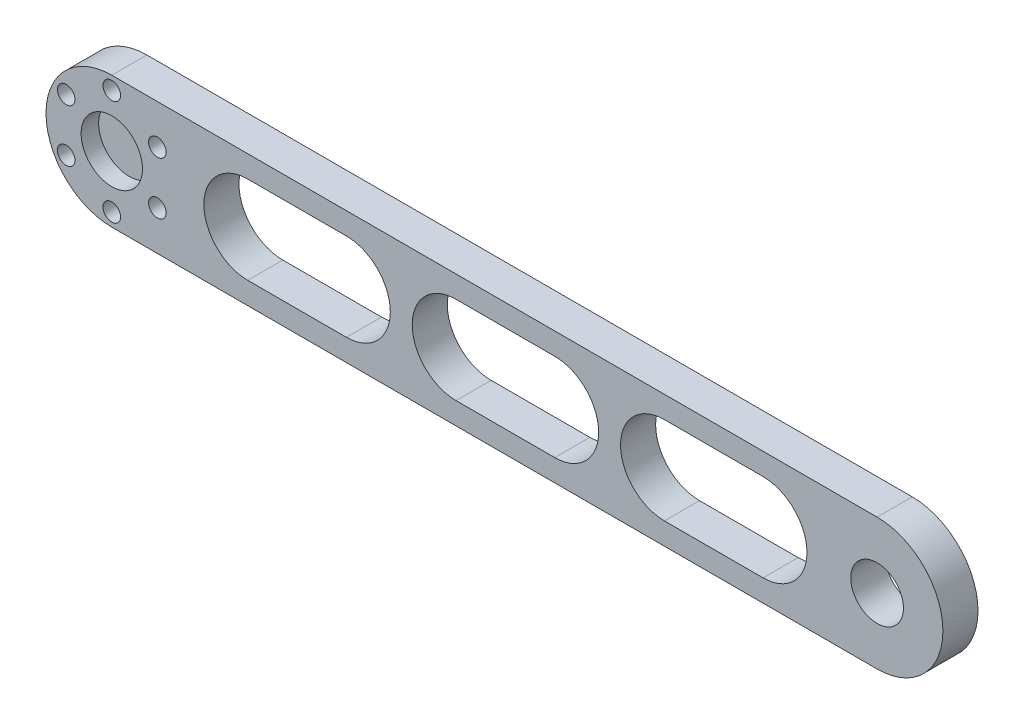
ISO-10303-21;
HEADER;
FILE_DESCRIPTION(('STEP AP214'),'2;1');
FILE_NAME('part.step','',(''),(''),'','','');
FILE_SCHEMA(('AUTOMOTIVE_DESIGN { 1 0 10303 214 1 1 1 1 }'));
ENDSEC;
DATA;
#1=APPLICATION_CONTEXT('core data for automotive mechanical design processes');
#2=APPLICATION_PROTOCOL_DEFINITION('international standard','automotive_design',2000,#1);
#3=PRODUCT_CONTEXT('',#1,'mechanical');
#4=PRODUCT('Part','Part','',(#3));
#5=PRODUCT_RELATED_PRODUCT_CATEGORY('part','',(#4));
#6=PRODUCT_DEFINITION_FORMATION('','',#4);
#7=PRODUCT_DEFINITION_CONTEXT('part definition',#1,'design');
#8=PRODUCT_DEFINITION('design','',#6,#7);
#9=PRODUCT_DEFINITION_SHAPE('','',#8);
#10=(LENGTH_UNIT() NAMED_UNIT(*) SI_UNIT(.MILLI.,.METRE.));
#11=(NAMED_UNIT(*) PLANE_ANGLE_UNIT() SI_UNIT($,.RADIAN.));
#12=(NAMED_UNIT(*) SI_UNIT($,.STERADIAN.) SOLID_ANGLE_UNIT());
#13=UNCERTAINTY_MEASURE_WITH_UNIT(LENGTH_MEASURE(1.E-05),#10,'distance_accuracy_value','');
#14=(GEOMETRIC_REPRESENTATION_CONTEXT(3) GLOBAL_UNCERTAINTY_ASSIGNED_CONTEXT((#13)) GLOBAL_UNIT_ASSIGNED_CONTEXT((#10,
#11,#12)) REPRESENTATION_CONTEXT('',''));
#15=CARTESIAN_POINT('',(0.,0.,0.));
#16=DIRECTION('',(0.,0.,1.));
#17=DIRECTION('',(1.,0.,0.));
#18=AXIS2_PLACEMENT_3D('',#15,#16,#17);
#19=CARTESIAN_POINT('',(-87.25,0.,0.));
#20=DIRECTION('',(0.,0.,1.));
#21=DIRECTION('',(1.,0.,0.));
#22=AXIS2_PLACEMENT_3D('',#19,#20,#21);
#23=PLANE('',#22);
#24=CARTESIAN_POINT('',(-97.6423048454133,-5.99999999999991,0.));
#25=DIRECTION('',(0.,0.,-1.));
#26=DIRECTION('',(-1.,0.,0.));
#27=AXIS2_PLACEMENT_3D('',#24,#25,#26);
#28=CIRCLE('',#27,1.99999999999999);
#29=CARTESIAN_POINT('',(-99.6423048454133,-5.99999999999991,0.));
#30=VERTEX_POINT('',#29);
#31=EDGE_CURVE('E420',#30,#30,#28,.T.);
#32=ORIENTED_EDGE('',*,*,#31,.F.);
#33=EDGE_LOOP('',(#32));
#34=FACE_BOUND('',#33,.T.);
#35=CARTESIAN_POINT('',(-87.25,-12.,0.));
#36=DIRECTION('',(0.,0.,-1.));
#37=DIRECTION('',(-1.,0.,0.));
#38=AXIS2_PLACEMENT_3D('',#35,#36,#37);
#39=CIRCLE('',#38,1.99999999999999);
#40=CARTESIAN_POINT('',(-89.25,-12.,0.));
#41=VERTEX_POINT('',#40);
#42=EDGE_CURVE('E426',#41,#41,#39,.T.);
#43=ORIENTED_EDGE('',*,*,#42,.F.);
#44=EDGE_LOOP('',(#43));
#45=FACE_BOUND('',#44,.T.);
#46=CARTESIAN_POINT('',(-87.25,12.,0.));
#47=DIRECTION('',(0.,0.,-1.));
#48=DIRECTION('',(-1.,0.,0.));
#49=AXIS2_PLACEMENT_3D('',#46,#47,#48);
#50=CIRCLE('',#49,1.99999999999999);
#51=CARTESIAN_POINT('',(-89.25,12.,0.));
#52=VERTEX_POINT('',#51);
#53=EDGE_CURVE('E444',#52,#52,#50,.T.);
#54=ORIENTED_EDGE('',*,*,#53,.F.);
#55=EDGE_LOOP('',(#54));
#56=FACE_BOUND('',#55,.T.);
#57=CARTESIAN_POINT('',(13.75,0.,0.));
#58=DIRECTION('',(0.,0.,1.));
#59=DIRECTION('',(1.,0.,0.));
#60=AXIS2_PLACEMENT_3D('',#57,#58,#59);
#61=CIRCLE('',#60,10.);
#62=CARTESIAN_POINT('',(13.75,-10.,0.));
#63=VERTEX_POINT('',#62);
#64=CARTESIAN_POINT('',(13.75,10.,0.));
#65=VERTEX_POINT('',#64);
#66=EDGE_CURVE('E169',#63,#65,#61,.T.);
#67=ORIENTED_EDGE('',*,*,#66,.T.);
#68=DIRECTION('',(-1.,0.,0.));
#69=VECTOR('',#68,1.);
#70=CARTESIAN_POINT('',(13.75,10.,0.));
#71=LINE('',#70,#69);
#72=CARTESIAN_POINT('',(-8.75,10.,0.));
#73=VERTEX_POINT('',#72);
#74=EDGE_CURVE('E205',#65,#73,#71,.T.);
#75=ORIENTED_EDGE('',*,*,#74,.T.);
#76=CARTESIAN_POINT('',(-8.75,0.,0.));
#77=DIRECTION('',(0.,0.,1.));
#78=DIRECTION('',(1.,0.,0.));
#79=AXIS2_PLACEMENT_3D('',#76,#77,#78);
#80=CIRCLE('',#79,10.);
#81=CARTESIAN_POINT('',(-8.75,-10.,0.));
#82=VERTEX_POINT('',#81);
#83=EDGE_CURVE('E208',#73,#82,#80,.T.);
#84=ORIENTED_EDGE('',*,*,#83,.T.);
#85=DIRECTION('',(1.,0.,0.));
#86=VECTOR('',#85,1.);
#87=CARTESIAN_POINT('',(13.75,-10.,0.));
#88=LINE('',#87,#86);
#89=EDGE_CURVE('E195',#82,#63,#88,.T.);
#90=ORIENTED_EDGE('',*,*,#89,.T.);
#91=EDGE_LOOP('',(#67,#75,#84,#90));
#92=FACE_BOUND('',#91,.T.);
#93=CARTESIAN_POINT('',(87.25,0.,0.));
#94=DIRECTION('',(0.,0.,1.));
#95=DIRECTION('',(1.,0.,0.));
#96=AXIS2_PLACEMENT_3D('',#93,#94,#95);
#97=CIRCLE('',#96,6.);
#98=CARTESIAN_POINT('',(93.25,0.,0.));
#99=VERTEX_POINT('',#98);
#100=EDGE_CURVE('E253',#99,#99,#97,.T.);
#101=ORIENTED_EDGE('',*,*,#100,.T.);
#102=EDGE_LOOP('',(#101));
#103=FACE_BOUND('',#102,.T.);
#104=CARTESIAN_POINT('',(-87.25,0.,0.));
#105=DIRECTION('',(0.,0.,1.));
#106=DIRECTION('',(1.,0.,0.));
#107=AXIS2_PLACEMENT_3D('',#104,#105,#106);
#108=CIRCLE('',#107,15.);
#109=CARTESIAN_POINT('',(-87.25,15.,0.));
#110=VERTEX_POINT('',#109);
#111=CARTESIAN_POINT('',(-87.25,-15.,0.));
#112=VERTEX_POINT('',#111);
#113=EDGE_CURVE('E257',#110,#112,#108,.T.);
#114=ORIENTED_EDGE('',*,*,#113,.F.);
#115=DIRECTION('',(-1.,0.,0.));
#116=VECTOR('',#115,1.);
#117=CARTESIAN_POINT('',(-87.25,15.,0.));
#118=LINE('',#117,#116);
#119=CARTESIAN_POINT('',(87.25,15.,0.));
#120=VERTEX_POINT('',#119);
#121=EDGE_CURVE('E264',#120,#110,#118,.T.);
#122=ORIENTED_EDGE('',*,*,#121,.F.);
#123=CARTESIAN_POINT('',(87.25,0.,0.));
#124=DIRECTION('',(0.,0.,1.));
#125=DIRECTION('',(1.,0.,0.));
#126=AXIS2_PLACEMENT_3D('',#123,#124,#125);
#127=CIRCLE('',#126,15.);
#128=CARTESIAN_POINT('',(87.25,-15.,0.));
#129=VERTEX_POINT('',#128);
#130=EDGE_CURVE('E275',#129,#120,#127,.T.);
#131=ORIENTED_EDGE('',*,*,#130,.F.);
#132=DIRECTION('',(1.,0.,0.));
#133=VECTOR('',#132,1.);
#134=CARTESIAN_POINT('',(-87.25,-15.,0.));
#135=LINE('',#134,#133);
#136=EDGE_CURVE('E273',#112,#129,#135,.T.);
#137=ORIENTED_EDGE('',*,*,#136,.F.);
#138=EDGE_LOOP('',(#114,#122,#131,#137));
#139=FACE_BOUND('',#138,.T.);
#140=CARTESIAN_POINT('',(61.25,0.,0.));
#141=DIRECTION('',(0.,0.,1.));
#142=DIRECTION('',(1.,0.,0.));
#143=AXIS2_PLACEMENT_3D('',#140,#141,#142);
#144=CIRCLE('',#143,10.);
#145=CARTESIAN_POINT('',(61.25,-10.,0.));
#146=VERTEX_POINT('',#145);
#147=CARTESIAN_POINT('',(61.25,10.,0.));
#148=VERTEX_POINT('',#147);
#149=EDGE_CURVE('E222',#146,#148,#144,.T.);
#150=ORIENTED_EDGE('',*,*,#149,.T.);
#151=DIRECTION('',(-1.,0.,0.));
#152=VECTOR('',#151,1.);
#153=CARTESIAN_POINT('',(61.25,10.,0.));
#154=LINE('',#153,#152);
#155=CARTESIAN_POINT('',(38.75,10.,0.));
#156=VERTEX_POINT('',#155);
#157=EDGE_CURVE('E236',#148,#156,#154,.T.);
#158=ORIENTED_EDGE('',*,*,#157,.T.);
#159=CARTESIAN_POINT('',(38.75,0.,0.));
#160=DIRECTION('',(0.,0.,1.));
#161=DIRECTION('',(1.,0.,0.));
#162=AXIS2_PLACEMENT_3D('',#159,#160,#161);
#163=CIRCLE('',#162,10.);
#164=CARTESIAN_POINT('',(38.75,-10.,0.));
#165=VERTEX_POINT('',#164);
#166=EDGE_CURVE('E239',#156,#165,#163,.T.);
#167=ORIENTED_EDGE('',*,*,#166,.T.);
#168=DIRECTION('',(1.,0.,0.));
#169=VECTOR('',#168,1.);
#170=CARTESIAN_POINT('',(61.25,-10.,0.));
#171=LINE('',#170,#169);
#172=EDGE_CURVE('E226',#165,#146,#171,.T.);
#173=ORIENTED_EDGE('',*,*,#172,.T.);
#174=EDGE_LOOP('',(#150,#158,#167,#173));
#175=FACE_BOUND('',#174,.T.);
#176=CARTESIAN_POINT('',(-33.75,0.,0.));
#177=DIRECTION('',(0.,0.,1.));
#178=DIRECTION('',(1.,0.,0.));
#179=AXIS2_PLACEMENT_3D('',#176,#177,#178);
#180=CIRCLE('',#179,10.);
#181=CARTESIAN_POINT('',(-33.75,-10.,0.));
#182=VERTEX_POINT('',#181);
#183=CARTESIAN_POINT('',(-33.75,10.,0.));
#184=VERTEX_POINT('',#183);
#185=EDGE_CURVE('E63',#182,#184,#180,.T.);
#186=ORIENTED_EDGE('',*,*,#185,.T.);
#187=DIRECTION('',(-1.,0.,0.));
#188=VECTOR('',#187,1.);
#189=CARTESIAN_POINT('',(-33.75,10.,0.));
#190=LINE('',#189,#188);
#191=CARTESIAN_POINT('',(-56.25,9.99999999999999,0.));
#192=VERTEX_POINT('',#191);
#193=EDGE_CURVE('E168',#184,#192,#190,.T.);
#194=ORIENTED_EDGE('',*,*,#193,.T.);
#195=CARTESIAN_POINT('',(-56.25,0.,0.));
#196=DIRECTION('',(0.,0.,1.));
#197=DIRECTION('',(1.,0.,0.));
#198=AXIS2_PLACEMENT_3D('',#195,#196,#197);
#199=CIRCLE('',#198,10.);
#200=CARTESIAN_POINT('',(-56.25,-10.,0.));
#201=VERTEX_POINT('',#200);
#202=EDGE_CURVE('E184',#192,#201,#199,.T.);
#203=ORIENTED_EDGE('',*,*,#202,.T.);
#204=DIRECTION('',(1.,0.,0.));
#205=VECTOR('',#204,1.);
#206=CARTESIAN_POINT('',(-33.75,-10.,0.));
#207=LINE('',#206,#205);
#208=EDGE_CURVE('E162',#201,#182,#207,.T.);
#209=ORIENTED_EDGE('',*,*,#208,.T.);
#210=EDGE_LOOP('',(#186,#194,#203,#209));
#211=FACE_BOUND('',#210,.T.);
#212=CARTESIAN_POINT('',(-76.8576951545867,5.99999999999998,0.));
#213=DIRECTION('',(0.,0.,-1.));
#214=DIRECTION('',(-1.,0.,0.));
#215=AXIS2_PLACEMENT_3D('',#212,#213,#214);
#216=CIRCLE('',#215,1.99999999999999);
#217=CARTESIAN_POINT('',(-78.8576951545867,5.99999999999998,0.));
#218=VERTEX_POINT('',#217);
#219=EDGE_CURVE('E438',#218,#218,#216,.T.);
#220=ORIENTED_EDGE('',*,*,#219,.F.);
#221=EDGE_LOOP('',(#220));
#222=FACE_BOUND('',#221,.T.);
#223=CARTESIAN_POINT('',(-76.8576951545868,-6.00000000000005,0.));
#224=DIRECTION('',(0.,0.,-1.));
#225=DIRECTION('',(-1.,0.,0.));
#226=AXIS2_PLACEMENT_3D('',#223,#224,#225);
#227=CIRCLE('',#226,1.99999999999999);
#228=CARTESIAN_POINT('',(-78.8576951545868,-6.00000000000005,0.));
#229=VERTEX_POINT('',#228);
#230=EDGE_CURVE('E432',#229,#229,#227,.T.);
#231=ORIENTED_EDGE('',*,*,#230,.F.);
#232=EDGE_LOOP('',(#231));
#233=FACE_BOUND('',#232,.T.);
#234=CARTESIAN_POINT('',(-97.6423048454132,6.00000000000012,0.));
#235=DIRECTION('',(0.,0.,-1.));
#236=DIRECTION('',(-1.,0.,0.));
#237=AXIS2_PLACEMENT_3D('',#234,#235,#236);
#238=CIRCLE('',#237,1.99999999999999);
#239=CARTESIAN_POINT('',(-99.6423048454132,6.00000000000012,0.));
#240=VERTEX_POINT('',#239);
#241=EDGE_CURVE('E412',#240,#240,#238,.T.);
#242=ORIENTED_EDGE('',*,*,#241,.F.);
#243=EDGE_LOOP('',(#242));
#244=FACE_BOUND('',#243,.T.);
#245=ADVANCED_FACE('F39',(#34,#45,#56,#92,#103,#139,#175,#211,#222,#233,#244),#23,.F.);
#246=CARTESIAN_POINT('',(-87.25,0.,8.));
#247=DIRECTION('',(0.,0.,1.));
#248=DIRECTION('',(1.,0.,0.));
#249=AXIS2_PLACEMENT_3D('',#246,#247,#248);
#250=PLANE('',#249);
#251=CARTESIAN_POINT('',(-87.25,0.,8.));
#252=DIRECTION('',(0.,0.,1.));
#253=DIRECTION('',(1.,0.,0.));
#254=AXIS2_PLACEMENT_3D('',#251,#252,#253);
#255=CIRCLE('',#254,7.);
#256=CARTESIAN_POINT('',(-80.25,0.,8.));
#257=VERTEX_POINT('',#256);
#258=EDGE_CURVE('E413',#257,#257,#255,.T.);
#259=ORIENTED_EDGE('',*,*,#258,.F.);
#260=EDGE_LOOP('',(#259));
#261=FACE_BOUND('',#260,.T.);
#262=CARTESIAN_POINT('',(-97.6423048454132,6.00000000000012,8.));
#263=DIRECTION('',(0.,0.,1.));
#264=DIRECTION('',(1.,0.,0.));
#265=AXIS2_PLACEMENT_3D('',#262,#263,#264);
#266=CIRCLE('',#265,1.99999999999998);
#267=CARTESIAN_POINT('',(-95.6423048454132,6.00000000000012,8.));
#268=VERTEX_POINT('',#267);
#269=EDGE_CURVE('E43',#268,#268,#266,.T.);
#270=ORIENTED_EDGE('',*,*,#269,.F.);
#271=EDGE_LOOP('',(#270));
#272=FACE_BOUND('',#271,.T.);
#273=CARTESIAN_POINT('',(-97.6423048454133,-5.99999999999991,8.));
#274=DIRECTION('',(0.,0.,1.));
#275=DIRECTION('',(1.,0.,0.));
#276=AXIS2_PLACEMENT_3D('',#273,#274,#275);
#277=CIRCLE('',#276,1.99999999999998);
#278=CARTESIAN_POINT('',(-95.6423048454133,-5.99999999999991,8.));
#279=VERTEX_POINT('',#278);
#280=EDGE_CURVE('E423',#279,#279,#277,.T.);
#281=ORIENTED_EDGE('',*,*,#280,.F.);
#282=EDGE_LOOP('',(#281));
#283=FACE_BOUND('',#282,.T.);
#284=CARTESIAN_POINT('',(-87.25,-12.,8.));
#285=DIRECTION('',(0.,0.,1.));
#286=DIRECTION('',(1.,0.,0.));
#287=AXIS2_PLACEMENT_3D('',#284,#285,#286);
#288=CIRCLE('',#287,1.99999999999998);
#289=CARTESIAN_POINT('',(-85.25,-12.,8.));
#290=VERTEX_POINT('',#289);
#291=EDGE_CURVE('E429',#290,#290,#288,.T.);
#292=ORIENTED_EDGE('',*,*,#291,.F.);
#293=EDGE_LOOP('',(#292));
#294=FACE_BOUND('',#293,.T.);
#295=CARTESIAN_POINT('',(-76.8576951545868,-6.00000000000005,8.));
#296=DIRECTION('',(0.,0.,1.));
#297=DIRECTION('',(1.,0.,0.));
#298=AXIS2_PLACEMENT_3D('',#295,#296,#297);
#299=CIRCLE('',#298,1.99999999999998);
#300=CARTESIAN_POINT('',(-74.8576951545868,-6.00000000000005,8.));
#301=VERTEX_POINT('',#300);
#302=EDGE_CURVE('E435',#301,#301,#299,.T.);
#303=ORIENTED_EDGE('',*,*,#302,.F.);
#304=EDGE_LOOP('',(#303));
#305=FACE_BOUND('',#304,.T.);
#306=CARTESIAN_POINT('',(-76.8576951545867,5.99999999999998,8.));
#307=DIRECTION('',(0.,0.,1.));
#308=DIRECTION('',(1.,0.,0.));
#309=AXIS2_PLACEMENT_3D('',#306,#307,#308);
#310=CIRCLE('',#309,1.99999999999998);
#311=CARTESIAN_POINT('',(-74.8576951545867,5.99999999999998,8.));
#312=VERTEX_POINT('',#311);
#313=EDGE_CURVE('E441',#312,#312,#310,.T.);
#314=ORIENTED_EDGE('',*,*,#313,.F.);
#315=EDGE_LOOP('',(#314));
#316=FACE_BOUND('',#315,.T.);
#317=CARTESIAN_POINT('',(-87.25,12.,8.));
#318=DIRECTION('',(0.,0.,1.));
#319=DIRECTION('',(1.,0.,0.));
#320=AXIS2_PLACEMENT_3D('',#317,#318,#319);
#321=CIRCLE('',#320,1.99999999999998);
#322=CARTESIAN_POINT('',(-85.25,12.,8.));
#323=VERTEX_POINT('',#322);
#324=EDGE_CURVE('E182',#323,#323,#321,.T.);
#325=ORIENTED_EDGE('',*,*,#324,.F.);
#326=EDGE_LOOP('',(#325));
#327=FACE_BOUND('',#326,.T.);
#328=CARTESIAN_POINT('',(-87.25,0.,8.));
#329=DIRECTION('',(0.,0.,1.));
#330=DIRECTION('',(1.,0.,0.));
#331=AXIS2_PLACEMENT_3D('',#328,#329,#330);
#332=CIRCLE('',#331,15.);
#333=CARTESIAN_POINT('',(-87.25,15.,8.));
#334=VERTEX_POINT('',#333);
#335=CARTESIAN_POINT('',(-87.25,-15.,8.));
#336=VERTEX_POINT('',#335);
#337=EDGE_CURVE('E260',#334,#336,#332,.T.);
#338=ORIENTED_EDGE('',*,*,#337,.T.);
#339=DIRECTION('',(1.,0.,0.));
#340=VECTOR('',#339,1.);
#341=CARTESIAN_POINT('',(-87.25,-15.,8.));
#342=LINE('',#341,#340);
#343=CARTESIAN_POINT('',(87.25,-15.,8.));
#344=VERTEX_POINT('',#343);
#345=EDGE_CURVE('E263',#336,#344,#342,.T.);
#346=ORIENTED_EDGE('',*,*,#345,.T.);
#347=CARTESIAN_POINT('',(87.25,0.,8.));
#348=DIRECTION('',(0.,0.,1.));
#349=DIRECTION('',(1.,0.,0.));
#350=AXIS2_PLACEMENT_3D('',#347,#348,#349);
#351=CIRCLE('',#350,15.);
#352=CARTESIAN_POINT('',(87.25,15.,8.));
#353=VERTEX_POINT('',#352);
#354=EDGE_CURVE('E266',#344,#353,#351,.T.);
#355=ORIENTED_EDGE('',*,*,#354,.T.);
#356=DIRECTION('',(-1.,0.,0.));
#357=VECTOR('',#356,1.);
#358=CARTESIAN_POINT('',(-87.25,15.,8.));
#359=LINE('',#358,#357);
#360=EDGE_CURVE('E268',#353,#334,#359,.T.);
#361=ORIENTED_EDGE('',*,*,#360,.T.);
#362=EDGE_LOOP('',(#338,#346,#355,#361));
#363=FACE_BOUND('',#362,.T.);
#364=CARTESIAN_POINT('',(87.25,0.,8.));
#365=DIRECTION('',(0.,0.,1.));
#366=DIRECTION('',(1.,0.,0.));
#367=AXIS2_PLACEMENT_3D('',#364,#365,#366);
#368=CIRCLE('',#367,6.);
#369=CARTESIAN_POINT('',(93.25,0.,8.));
#370=VERTEX_POINT('',#369);
#371=EDGE_CURVE('E254',#370,#370,#368,.T.);
#372=ORIENTED_EDGE('',*,*,#371,.F.);
#373=EDGE_LOOP('',(#372));
#374=FACE_BOUND('',#373,.T.);
#375=DIRECTION('',(-1.,0.,0.));
#376=VECTOR('',#375,1.);
#377=CARTESIAN_POINT('',(61.25,10.,8.));
#378=LINE('',#377,#376);
#379=CARTESIAN_POINT('',(61.25,10.,8.));
#380=VERTEX_POINT('',#379);
#381=CARTESIAN_POINT('',(38.75,10.,8.));
#382=VERTEX_POINT('',#381);
#383=EDGE_CURVE('E225',#380,#382,#378,.T.);
#384=ORIENTED_EDGE('',*,*,#383,.F.);
#385=CARTESIAN_POINT('',(61.25,0.,8.));
#386=DIRECTION('',(0.,0.,1.));
#387=DIRECTION('',(1.,0.,0.));
#388=AXIS2_PLACEMENT_3D('',#385,#386,#387);
#389=CIRCLE('',#388,10.);
#390=CARTESIAN_POINT('',(61.25,-10.,8.));
#391=VERTEX_POINT('',#390);
#392=EDGE_CURVE('E223',#391,#380,#389,.T.);
#393=ORIENTED_EDGE('',*,*,#392,.F.);
#394=DIRECTION('',(1.,0.,0.));
#395=VECTOR('',#394,1.);
#396=CARTESIAN_POINT('',(61.25,-10.,8.));
#397=LINE('',#396,#395);
#398=CARTESIAN_POINT('',(38.75,-10.,8.));
#399=VERTEX_POINT('',#398);
#400=EDGE_CURVE('E231',#399,#391,#397,.T.);
#401=ORIENTED_EDGE('',*,*,#400,.F.);
#402=CARTESIAN_POINT('',(38.75,0.,8.));
#403=DIRECTION('',(0.,0.,1.));
#404=DIRECTION('',(1.,0.,0.));
#405=AXIS2_PLACEMENT_3D('',#402,#403,#404);
#406=CIRCLE('',#405,10.);
#407=EDGE_CURVE('E228',#382,#399,#406,.T.);
#408=ORIENTED_EDGE('',*,*,#407,.F.);
#409=EDGE_LOOP('',(#384,#393,#401,#408));
#410=FACE_BOUND('',#409,.T.);
#411=DIRECTION('',(-1.,0.,0.));
#412=VECTOR('',#411,1.);
#413=CARTESIAN_POINT('',(13.75,10.,8.));
#414=LINE('',#413,#412);
#415=CARTESIAN_POINT('',(13.75,10.,8.));
#416=VERTEX_POINT('',#415);
#417=CARTESIAN_POINT('',(-8.75,10.,8.));
#418=VERTEX_POINT('',#417);
#419=EDGE_CURVE('E194',#416,#418,#414,.T.);
#420=ORIENTED_EDGE('',*,*,#419,.F.);
#421=CARTESIAN_POINT('',(13.75,0.,8.));
#422=DIRECTION('',(0.,0.,1.));
#423=DIRECTION('',(1.,0.,0.));
#424=AXIS2_PLACEMENT_3D('',#421,#422,#423);
#425=CIRCLE('',#424,10.);
#426=CARTESIAN_POINT('',(13.75,-10.,8.));
#427=VERTEX_POINT('',#426);
#428=EDGE_CURVE('E192',#427,#416,#425,.T.);
#429=ORIENTED_EDGE('',*,*,#428,.F.);
#430=DIRECTION('',(1.,0.,0.));
#431=VECTOR('',#430,1.);
#432=CARTESIAN_POINT('',(13.75,-10.,8.));
#433=LINE('',#432,#431);
#434=CARTESIAN_POINT('',(-8.74999999999999,-10.,8.));
#435=VERTEX_POINT('',#434);
#436=EDGE_CURVE('E200',#435,#427,#433,.T.);
#437=ORIENTED_EDGE('',*,*,#436,.F.);
#438=CARTESIAN_POINT('',(-8.75,0.,8.));
#439=DIRECTION('',(0.,0.,1.));
#440=DIRECTION('',(1.,0.,0.));
#441=AXIS2_PLACEMENT_3D('',#438,#439,#440);
#442=CIRCLE('',#441,10.);
#443=EDGE_CURVE('E197',#418,#435,#442,.T.);
#444=ORIENTED_EDGE('',*,*,#443,.F.);
#445=EDGE_LOOP('',(#420,#429,#437,#444));
#446=FACE_BOUND('',#445,.T.);
#447=DIRECTION('',(-1.,0.,0.));
#448=VECTOR('',#447,1.);
#449=CARTESIAN_POINT('',(-33.75,10.,8.));
#450=LINE('',#449,#448);
#451=CARTESIAN_POINT('',(-33.75,10.,8.));
#452=VERTEX_POINT('',#451);
#453=CARTESIAN_POINT('',(-56.25,9.99999999999999,8.));
#454=VERTEX_POINT('',#453);
#455=EDGE_CURVE('E161',#452,#454,#450,.T.);
#456=ORIENTED_EDGE('',*,*,#455,.F.);
#457=CARTESIAN_POINT('',(-33.75,0.,8.));
#458=DIRECTION('',(0.,0.,1.));
#459=DIRECTION('',(1.,0.,0.));
#460=AXIS2_PLACEMENT_3D('',#457,#458,#459);
#461=CIRCLE('',#460,10.);
#462=CARTESIAN_POINT('',(-33.75,-10.,8.));
#463=VERTEX_POINT('',#462);
#464=EDGE_CURVE('E153',#463,#452,#461,.T.);
#465=ORIENTED_EDGE('',*,*,#464,.F.);
#466=DIRECTION('',(1.,0.,0.));
#467=VECTOR('',#466,1.);
#468=CARTESIAN_POINT('',(-33.75,-10.,8.));
#469=LINE('',#468,#467);
#470=CARTESIAN_POINT('',(-56.25,-10.,8.));
#471=VERTEX_POINT('',#470);
#472=EDGE_CURVE('E176',#471,#463,#469,.T.);
#473=ORIENTED_EDGE('',*,*,#472,.F.);
#474=CARTESIAN_POINT('',(-56.25,0.,8.));
#475=DIRECTION('',(0.,0.,1.));
#476=DIRECTION('',(1.,0.,0.));
#477=AXIS2_PLACEMENT_3D('',#474,#475,#476);
#478=CIRCLE('',#477,10.);
#479=EDGE_CURVE('E174',#454,#471,#478,.T.);
#480=ORIENTED_EDGE('',*,*,#479,.F.);
#481=EDGE_LOOP('',(#456,#465,#473,#480));
#482=FACE_BOUND('',#481,.T.);
#483=ADVANCED_FACE('F173',(#261,#272,#283,#294,#305,#316,#327,#363,#374,#410,#446,#482),#250,.T.);
#484=CARTESIAN_POINT('',(-87.25,0.,8.));
#485=DIRECTION('',(0.,0.,-1.));
#486=DIRECTION('',(-1.,0.,0.));
#487=AXIS2_PLACEMENT_3D('',#484,#485,#486);
#488=CYLINDRICAL_SURFACE('',#487,15.);
#489=ORIENTED_EDGE('',*,*,#113,.T.);
#490=DIRECTION('',(0.,0.,-1.));
#491=VECTOR('',#490,1.);
#492=CARTESIAN_POINT('',(-87.25,-15.,8.));
#493=LINE('',#492,#491);
#494=EDGE_CURVE('E11',#336,#112,#493,.T.);
#495=ORIENTED_EDGE('',*,*,#494,.F.);
#496=ORIENTED_EDGE('',*,*,#337,.F.);
#497=DIRECTION('',(0.,0.,-1.));
#498=VECTOR('',#497,1.);
#499=CARTESIAN_POINT('',(-87.25,15.,8.));
#500=LINE('',#499,#498);
#501=EDGE_CURVE('E270',#334,#110,#500,.T.);
#502=ORIENTED_EDGE('',*,*,#501,.T.);
#503=EDGE_LOOP('',(#489,#495,#496,#502));
#504=FACE_BOUND('',#503,.T.);
#505=ADVANCED_FACE('F41',(#504),#488,.T.);
#506=CARTESIAN_POINT('',(-87.25,-15.,8.));
#507=DIRECTION('',(0.,1.,0.));
#508=DIRECTION('',(0.,0.,1.));
#509=AXIS2_PLACEMENT_3D('',#506,#507,#508);
#510=PLANE('',#509);
#511=ORIENTED_EDGE('',*,*,#136,.T.);
#512=DIRECTION('',(0.,0.,-1.));
#513=VECTOR('',#512,1.);
#514=CARTESIAN_POINT('',(87.25,-15.,8.));
#515=LINE('',#514,#513);
#516=EDGE_CURVE('E48',#344,#129,#515,.T.);
#517=ORIENTED_EDGE('',*,*,#516,.F.);
#518=ORIENTED_EDGE('',*,*,#345,.F.);
#519=ORIENTED_EDGE('',*,*,#494,.T.);
#520=EDGE_LOOP('',(#511,#517,#518,#519));
#521=FACE_BOUND('',#520,.T.);
#522=ADVANCED_FACE('F304',(#521),#510,.F.);
#523=CARTESIAN_POINT('',(87.25,0.,8.));
#524=DIRECTION('',(0.,0.,-1.));
#525=DIRECTION('',(-1.,0.,0.));
#526=AXIS2_PLACEMENT_3D('',#523,#524,#525);
#527=CYLINDRICAL_SURFACE('',#526,15.);
#528=ORIENTED_EDGE('',*,*,#130,.T.);
#529=DIRECTION('',(0.,0.,-1.));
#530=VECTOR('',#529,1.);
#531=CARTESIAN_POINT('',(87.25,15.,8.));
#532=LINE('',#531,#530);
#533=EDGE_CURVE('E280',#353,#120,#532,.T.);
#534=ORIENTED_EDGE('',*,*,#533,.F.);
#535=ORIENTED_EDGE('',*,*,#354,.F.);
#536=ORIENTED_EDGE('',*,*,#516,.T.);
#537=EDGE_LOOP('',(#528,#534,#535,#536));
#538=FACE_BOUND('',#537,.T.);
#539=ADVANCED_FACE('F288',(#538),#527,.T.);
#540=CARTESIAN_POINT('',(-87.25,15.,8.));
#541=DIRECTION('',(0.,-1.,0.));
#542=DIRECTION('',(0.,0.,-1.));
#543=AXIS2_PLACEMENT_3D('',#540,#541,#542);
#544=PLANE('',#543);
#545=ORIENTED_EDGE('',*,*,#121,.T.);
#546=ORIENTED_EDGE('',*,*,#501,.F.);
#547=ORIENTED_EDGE('',*,*,#360,.F.);
#548=ORIENTED_EDGE('',*,*,#533,.T.);
#549=EDGE_LOOP('',(#545,#546,#547,#548));
#550=FACE_BOUND('',#549,.T.);
#551=ADVANCED_FACE('F297',(#550),#544,.F.);
#552=CARTESIAN_POINT('',(87.25,0.,8.));
#553=DIRECTION('',(0.,0.,-1.));
#554=DIRECTION('',(-1.,0.,0.));
#555=AXIS2_PLACEMENT_3D('',#552,#553,#554);
#556=CYLINDRICAL_SURFACE('',#555,6.);
#557=ORIENTED_EDGE('',*,*,#371,.T.);
#558=EDGE_LOOP('',(#557));
#559=FACE_BOUND('',#558,.T.);
#560=ORIENTED_EDGE('',*,*,#100,.F.);
#561=EDGE_LOOP('',(#560));
#562=FACE_BOUND('',#561,.T.);
#563=ADVANCED_FACE('F326',(#559,#562),#556,.F.);
#564=CARTESIAN_POINT('',(61.25,0.,8.));
#565=DIRECTION('',(0.,0.,-1.));
#566=DIRECTION('',(-1.,0.,0.));
#567=AXIS2_PLACEMENT_3D('',#564,#565,#566);
#568=CYLINDRICAL_SURFACE('',#567,10.);
#569=ORIENTED_EDGE('',*,*,#149,.F.);
#570=DIRECTION('',(0.,0.,-1.));
#571=VECTOR('',#570,1.);
#572=CARTESIAN_POINT('',(61.25,-10.,8.));
#573=LINE('',#572,#571);
#574=EDGE_CURVE('E233',#391,#146,#573,.T.);
#575=ORIENTED_EDGE('',*,*,#574,.F.);
#576=ORIENTED_EDGE('',*,*,#392,.T.);
#577=DIRECTION('',(0.,0.,-1.));
#578=VECTOR('',#577,1.);
#579=CARTESIAN_POINT('',(61.25,10.,8.));
#580=LINE('',#579,#578);
#581=EDGE_CURVE('E250',#380,#148,#580,.T.);
#582=ORIENTED_EDGE('',*,*,#581,.T.);
#583=EDGE_LOOP('',(#569,#575,#576,#582));
#584=FACE_BOUND('',#583,.T.);
#585=ADVANCED_FACE('F330',(#584),#568,.F.);
#586=CARTESIAN_POINT('',(61.25,10.,8.));
#587=DIRECTION('',(0.,-1.,0.));
#588=DIRECTION('',(1.,0.,0.));
#589=AXIS2_PLACEMENT_3D('',#586,#587,#588);
#590=PLANE('',#589);
#591=ORIENTED_EDGE('',*,*,#157,.F.);
#592=ORIENTED_EDGE('',*,*,#581,.F.);
#593=ORIENTED_EDGE('',*,*,#383,.T.);
#594=DIRECTION('',(0.,0.,-1.));
#595=VECTOR('',#594,1.);
#596=CARTESIAN_POINT('',(38.75,10.,8.));
#597=LINE('',#596,#595);
#598=EDGE_CURVE('E248',#382,#156,#597,.T.);
#599=ORIENTED_EDGE('',*,*,#598,.T.);
#600=EDGE_LOOP('',(#591,#592,#593,#599));
#601=FACE_BOUND('',#600,.T.);
#602=ADVANCED_FACE('F335',(#601),#590,.T.);
#603=CARTESIAN_POINT('',(38.75,0.,8.));
#604=DIRECTION('',(0.,0.,-1.));
#605=DIRECTION('',(-1.,0.,0.));
#606=AXIS2_PLACEMENT_3D('',#603,#604,#605);
#607=CYLINDRICAL_SURFACE('',#606,10.);
#608=ORIENTED_EDGE('',*,*,#166,.F.);
#609=ORIENTED_EDGE('',*,*,#598,.F.);
#610=ORIENTED_EDGE('',*,*,#407,.T.);
#611=DIRECTION('',(0.,0.,-1.));
#612=VECTOR('',#611,1.);
#613=CARTESIAN_POINT('',(38.75,-10.,8.));
#614=LINE('',#613,#612);
#615=EDGE_CURVE('E246',#399,#165,#614,.T.);
#616=ORIENTED_EDGE('',*,*,#615,.T.);
#617=EDGE_LOOP('',(#608,#609,#610,#616));
#618=FACE_BOUND('',#617,.T.);
#619=ADVANCED_FACE('F342',(#618),#607,.F.);
#620=CARTESIAN_POINT('',(61.25,-10.,8.));
#621=DIRECTION('',(0.,1.,0.));
#622=DIRECTION('',(-1.,0.,0.));
#623=AXIS2_PLACEMENT_3D('',#620,#621,#622);
#624=PLANE('',#623);
#625=ORIENTED_EDGE('',*,*,#172,.F.);
#626=ORIENTED_EDGE('',*,*,#615,.F.);
#627=ORIENTED_EDGE('',*,*,#400,.T.);
#628=ORIENTED_EDGE('',*,*,#574,.T.);
#629=EDGE_LOOP('',(#625,#626,#627,#628));
#630=FACE_BOUND('',#629,.T.);
#631=ADVANCED_FACE('F346',(#630),#624,.T.);
#632=CARTESIAN_POINT('',(13.75,0.,8.));
#633=DIRECTION('',(0.,0.,-1.));
#634=DIRECTION('',(-1.,0.,0.));
#635=AXIS2_PLACEMENT_3D('',#632,#633,#634);
#636=CYLINDRICAL_SURFACE('',#635,10.);
#637=ORIENTED_EDGE('',*,*,#66,.F.);
#638=DIRECTION('',(0.,0.,-1.));
#639=VECTOR('',#638,1.);
#640=CARTESIAN_POINT('',(13.75,-10.,8.));
#641=LINE('',#640,#639);
#642=EDGE_CURVE('E202',#427,#63,#641,.T.);
#643=ORIENTED_EDGE('',*,*,#642,.F.);
#644=ORIENTED_EDGE('',*,*,#428,.T.);
#645=DIRECTION('',(0.,0.,-1.));
#646=VECTOR('',#645,1.);
#647=CARTESIAN_POINT('',(13.75,10.,8.));
#648=LINE('',#647,#646);
#649=EDGE_CURVE('E219',#416,#65,#648,.T.);
#650=ORIENTED_EDGE('',*,*,#649,.T.);
#651=EDGE_LOOP('',(#637,#643,#644,#650));
#652=FACE_BOUND('',#651,.T.);
#653=ADVANCED_FACE('F350',(#652),#636,.F.);
#654=CARTESIAN_POINT('',(13.75,10.,8.));
#655=DIRECTION('',(0.,-1.,0.));
#656=DIRECTION('',(1.,0.,0.));
#657=AXIS2_PLACEMENT_3D('',#654,#655,#656);
#658=PLANE('',#657);
#659=ORIENTED_EDGE('',*,*,#74,.F.);
#660=ORIENTED_EDGE('',*,*,#649,.F.);
#661=ORIENTED_EDGE('',*,*,#419,.T.);
#662=DIRECTION('',(0.,0.,-1.));
#663=VECTOR('',#662,1.);
#664=CARTESIAN_POINT('',(-8.75,10.,8.));
#665=LINE('',#664,#663);
#666=EDGE_CURVE('E217',#418,#73,#665,.T.);
#667=ORIENTED_EDGE('',*,*,#666,.T.);
#668=EDGE_LOOP('',(#659,#660,#661,#667));
#669=FACE_BOUND('',#668,.T.);
#670=ADVANCED_FACE('F354',(#669),#658,.T.);
#671=CARTESIAN_POINT('',(-8.75,0.,8.));
#672=DIRECTION('',(0.,0.,-1.));
#673=DIRECTION('',(-1.,0.,0.));
#674=AXIS2_PLACEMENT_3D('',#671,#672,#673);
#675=CYLINDRICAL_SURFACE('',#674,10.);
#676=ORIENTED_EDGE('',*,*,#83,.F.);
#677=ORIENTED_EDGE('',*,*,#666,.F.);
#678=ORIENTED_EDGE('',*,*,#443,.T.);
#679=DIRECTION('',(0.,0.,-1.));
#680=VECTOR('',#679,1.);
#681=CARTESIAN_POINT('',(-8.75,-10.,8.));
#682=LINE('',#681,#680);
#683=EDGE_CURVE('E215',#435,#82,#682,.T.);
#684=ORIENTED_EDGE('',*,*,#683,.T.);
#685=EDGE_LOOP('',(#676,#677,#678,#684));
#686=FACE_BOUND('',#685,.T.);
#687=ADVANCED_FACE('F358',(#686),#675,.F.);
#688=CARTESIAN_POINT('',(13.75,-10.,8.));
#689=DIRECTION('',(0.,1.,0.));
#690=DIRECTION('',(-1.,0.,0.));
#691=AXIS2_PLACEMENT_3D('',#688,#689,#690);
#692=PLANE('',#691);
#693=ORIENTED_EDGE('',*,*,#89,.F.);
#694=ORIENTED_EDGE('',*,*,#683,.F.);
#695=ORIENTED_EDGE('',*,*,#436,.T.);
#696=ORIENTED_EDGE('',*,*,#642,.T.);
#697=EDGE_LOOP('',(#693,#694,#695,#696));
#698=FACE_BOUND('',#697,.T.);
#699=ADVANCED_FACE('F362',(#698),#692,.T.);
#700=CARTESIAN_POINT('',(-33.75,0.,8.));
#701=DIRECTION('',(0.,0.,-1.));
#702=DIRECTION('',(-1.,0.,0.));
#703=AXIS2_PLACEMENT_3D('',#700,#701,#702);
#704=CYLINDRICAL_SURFACE('',#703,10.);
#705=ORIENTED_EDGE('',*,*,#185,.F.);
#706=DIRECTION('',(0.,0.,-1.));
#707=VECTOR('',#706,1.);
#708=CARTESIAN_POINT('',(-33.75,-10.,8.));
#709=LINE('',#708,#707);
#710=EDGE_CURVE('E157',#463,#182,#709,.T.);
#711=ORIENTED_EDGE('',*,*,#710,.F.);
#712=ORIENTED_EDGE('',*,*,#464,.T.);
#713=DIRECTION('',(0.,0.,-1.));
#714=VECTOR('',#713,1.);
#715=CARTESIAN_POINT('',(-33.75,10.,8.));
#716=LINE('',#715,#714);
#717=EDGE_CURVE('E156',#452,#184,#716,.T.);
#718=ORIENTED_EDGE('',*,*,#717,.T.);
#719=EDGE_LOOP('',(#705,#711,#712,#718));
#720=FACE_BOUND('',#719,.T.);
#721=ADVANCED_FACE('F155',(#720),#704,.F.);
#722=CARTESIAN_POINT('',(-33.75,10.,8.));
#723=DIRECTION('',(0.,-1.,0.));
#724=DIRECTION('',(1.,0.,0.));
#725=AXIS2_PLACEMENT_3D('',#722,#723,#724);
#726=PLANE('',#725);
#727=ORIENTED_EDGE('',*,*,#193,.F.);
#728=ORIENTED_EDGE('',*,*,#717,.F.);
#729=ORIENTED_EDGE('',*,*,#455,.T.);
#730=DIRECTION('',(0.,0.,-1.));
#731=VECTOR('',#730,1.);
#732=CARTESIAN_POINT('',(-56.25,9.99999999999999,8.));
#733=LINE('',#732,#731);
#734=EDGE_CURVE('E170',#454,#192,#733,.T.);
#735=ORIENTED_EDGE('',*,*,#734,.T.);
#736=EDGE_LOOP('',(#727,#728,#729,#735));
#737=FACE_BOUND('',#736,.T.);
#738=ADVANCED_FACE('F165',(#737),#726,.T.);
#739=CARTESIAN_POINT('',(-56.25,0.,8.));
#740=DIRECTION('',(0.,0.,-1.));
#741=DIRECTION('',(-1.,0.,0.));
#742=AXIS2_PLACEMENT_3D('',#739,#740,#741);
#743=CYLINDRICAL_SURFACE('',#742,10.);
#744=ORIENTED_EDGE('',*,*,#202,.F.);
#745=ORIENTED_EDGE('',*,*,#734,.F.);
#746=ORIENTED_EDGE('',*,*,#479,.T.);
#747=DIRECTION('',(0.,0.,-1.));
#748=VECTOR('',#747,1.);
#749=CARTESIAN_POINT('',(-56.25,-10.,8.));
#750=LINE('',#749,#748);
#751=EDGE_CURVE('E55',#471,#201,#750,.T.);
#752=ORIENTED_EDGE('',*,*,#751,.T.);
#753=EDGE_LOOP('',(#744,#745,#746,#752));
#754=FACE_BOUND('',#753,.T.);
#755=ADVANCED_FACE('F371',(#754),#743,.F.);
#756=CARTESIAN_POINT('',(-33.75,-10.,8.));
#757=DIRECTION('',(0.,1.,0.));
#758=DIRECTION('',(-1.,0.,0.));
#759=AXIS2_PLACEMENT_3D('',#756,#757,#758);
#760=PLANE('',#759);
#761=ORIENTED_EDGE('',*,*,#208,.F.);
#762=ORIENTED_EDGE('',*,*,#751,.F.);
#763=ORIENTED_EDGE('',*,*,#472,.T.);
#764=ORIENTED_EDGE('',*,*,#710,.T.);
#765=EDGE_LOOP('',(#761,#762,#763,#764));
#766=FACE_BOUND('',#765,.T.);
#767=ADVANCED_FACE('F374',(#766),#760,.T.);
#768=CARTESIAN_POINT('',(-87.25,12.,0.));
#769=DIRECTION('',(0.,0.,-1.));
#770=DIRECTION('',(-1.,0.,0.));
#771=AXIS2_PLACEMENT_3D('',#768,#769,#770);
#772=CYLINDRICAL_SURFACE('',#771,1.99999999999998);
#773=ORIENTED_EDGE('',*,*,#324,.T.);
#774=EDGE_LOOP('',(#773));
#775=FACE_BOUND('',#774,.T.);
#776=ORIENTED_EDGE('',*,*,#53,.T.);
#777=EDGE_LOOP('',(#776));
#778=FACE_BOUND('',#777,.T.);
#779=ADVANCED_FACE('F378',(#775,#778),#772,.F.);
#780=CARTESIAN_POINT('',(-76.8576951545867,5.99999999999998,0.));
#781=DIRECTION('',(0.,0.,-1.));
#782=DIRECTION('',(-1.,0.,0.));
#783=AXIS2_PLACEMENT_3D('',#780,#781,#782);
#784=CYLINDRICAL_SURFACE('',#783,1.99999999999998);
#785=ORIENTED_EDGE('',*,*,#313,.T.);
#786=EDGE_LOOP('',(#785));
#787=FACE_BOUND('',#786,.T.);
#788=ORIENTED_EDGE('',*,*,#219,.T.);
#789=EDGE_LOOP('',(#788));
#790=FACE_BOUND('',#789,.T.);
#791=ADVANCED_FACE('F380',(#787,#790),#784,.F.);
#792=CARTESIAN_POINT('',(-76.8576951545868,-6.00000000000005,0.));
#793=DIRECTION('',(0.,0.,-1.));
#794=DIRECTION('',(-1.,0.,0.));
#795=AXIS2_PLACEMENT_3D('',#792,#793,#794);
#796=CYLINDRICAL_SURFACE('',#795,1.99999999999998);
#797=ORIENTED_EDGE('',*,*,#302,.T.);
#798=EDGE_LOOP('',(#797));
#799=FACE_BOUND('',#798,.T.);
#800=ORIENTED_EDGE('',*,*,#230,.T.);
#801=EDGE_LOOP('',(#800));
#802=FACE_BOUND('',#801,.T.);
#803=ADVANCED_FACE('F383',(#799,#802),#796,.F.);
#804=CARTESIAN_POINT('',(-87.25,-12.,0.));
#805=DIRECTION('',(0.,0.,-1.));
#806=DIRECTION('',(-1.,0.,0.));
#807=AXIS2_PLACEMENT_3D('',#804,#805,#806);
#808=CYLINDRICAL_SURFACE('',#807,1.99999999999998);
#809=ORIENTED_EDGE('',*,*,#291,.T.);
#810=EDGE_LOOP('',(#809));
#811=FACE_BOUND('',#810,.T.);
#812=ORIENTED_EDGE('',*,*,#42,.T.);
#813=EDGE_LOOP('',(#812));
#814=FACE_BOUND('',#813,.T.);
#815=ADVANCED_FACE('F387',(#811,#814),#808,.F.);
#816=CARTESIAN_POINT('',(-97.6423048454133,-5.99999999999991,0.));
#817=DIRECTION('',(0.,0.,-1.));
#818=DIRECTION('',(-1.,0.,0.));
#819=AXIS2_PLACEMENT_3D('',#816,#817,#818);
#820=CYLINDRICAL_SURFACE('',#819,1.99999999999998);
#821=ORIENTED_EDGE('',*,*,#280,.T.);
#822=EDGE_LOOP('',(#821));
#823=FACE_BOUND('',#822,.T.);
#824=ORIENTED_EDGE('',*,*,#31,.T.);
#825=EDGE_LOOP('',(#824));
#826=FACE_BOUND('',#825,.T.);
#827=ADVANCED_FACE('F391',(#823,#826),#820,.F.);
#828=CARTESIAN_POINT('',(-97.6423048454132,6.00000000000012,0.));
#829=DIRECTION('',(0.,0.,-1.));
#830=DIRECTION('',(-1.,0.,0.));
#831=AXIS2_PLACEMENT_3D('',#828,#829,#830);
#832=CYLINDRICAL_SURFACE('',#831,1.99999999999998);
#833=ORIENTED_EDGE('',*,*,#269,.T.);
#834=EDGE_LOOP('',(#833));
#835=FACE_BOUND('',#834,.T.);
#836=ORIENTED_EDGE('',*,*,#241,.T.);
#837=EDGE_LOOP('',(#836));
#838=FACE_BOUND('',#837,.T.);
#839=ADVANCED_FACE('F395',(#835,#838),#832,.F.);
#840=CARTESIAN_POINT('',(-87.25,0.,4.));
#841=DIRECTION('',(0.,0.,1.));
#842=DIRECTION('',(1.,0.,0.));
#843=AXIS2_PLACEMENT_3D('',#840,#841,#842);
#844=CYLINDRICAL_SURFACE('',#843,7.);
#845=CARTESIAN_POINT('',(-87.25,0.,4.));
#846=DIRECTION('',(0.,0.,1.));
#847=DIRECTION('',(1.,0.,0.));
#848=AXIS2_PLACEMENT_3D('',#845,#846,#847);
#849=CIRCLE('',#848,7.);
#850=CARTESIAN_POINT('',(-80.25,0.,4.));
#851=VERTEX_POINT('',#850);
#852=EDGE_CURVE('E411',#851,#851,#849,.T.);
#853=ORIENTED_EDGE('',*,*,#852,.F.);
#854=EDGE_LOOP('',(#853));
#855=FACE_BOUND('',#854,.T.);
#856=ORIENTED_EDGE('',*,*,#258,.T.);
#857=EDGE_LOOP('',(#856));
#858=FACE_BOUND('',#857,.T.);
#859=ADVANCED_FACE('F399',(#855,#858),#844,.F.);
#860=CARTESIAN_POINT('',(-87.25,0.,4.));
#861=DIRECTION('',(0.,0.,1.));
#862=DIRECTION('',(1.,0.,0.));
#863=AXIS2_PLACEMENT_3D('',#860,#861,#862);
#864=PLANE('',#863);
#865=ORIENTED_EDGE('',*,*,#852,.T.);
#866=EDGE_LOOP('',(#865));
#867=FACE_BOUND('',#866,.T.);
#868=ADVANCED_FACE('F403',(#867),#864,.T.);
#869=CLOSED_SHELL('',(#245,#483,#505,#522,#539,#551,#563,#585,#602,#619,#631,#653,#670,#687,
#699,#721,#738,#755,#767,#779,#791,#803,#815,#827,#839,#859,#868));
#870=MANIFOLD_SOLID_BREP('B2',#869);
#871=ADVANCED_BREP_SHAPE_REPRESENTATION('',(#18,#870),#14);
#872=SHAPE_DEFINITION_REPRESENTATION(#9,#871);
ENDSEC;
END-ISO-10303-21;
